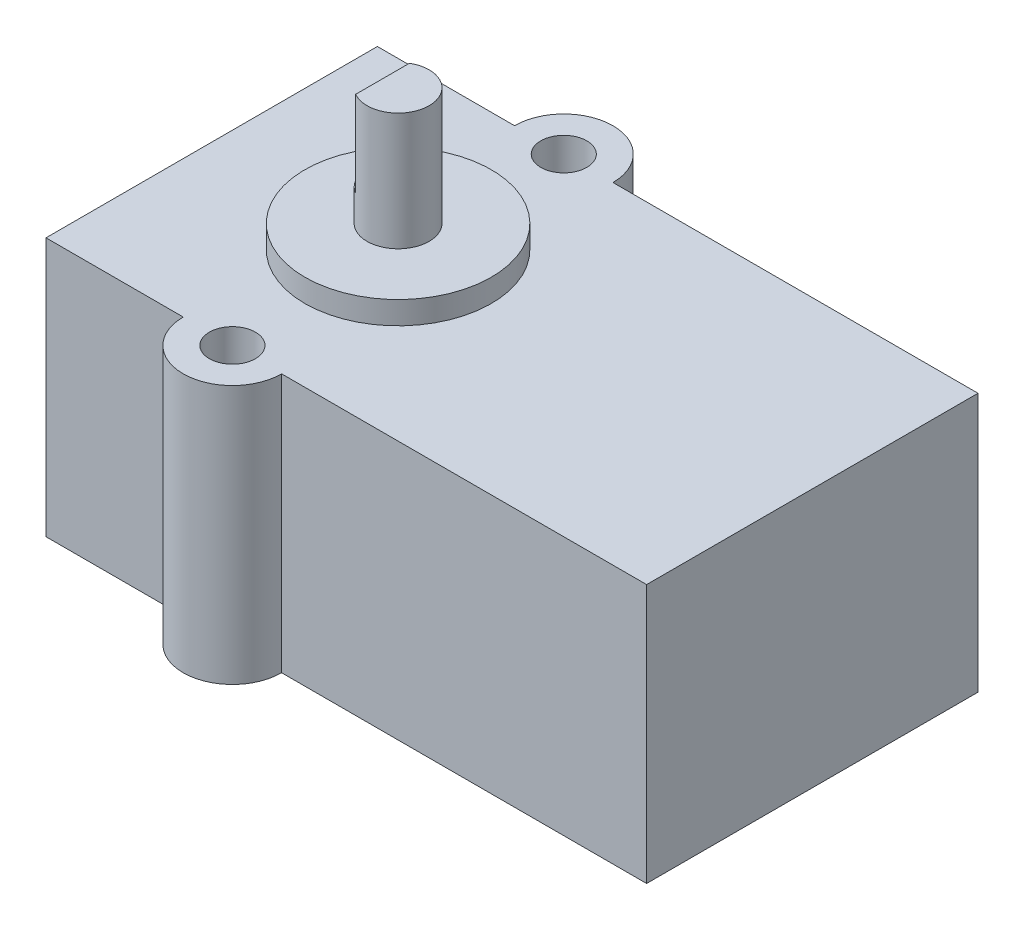
ISO-10303-21;
HEADER;
FILE_DESCRIPTION(('STEP AP214'),'2;1');
FILE_NAME('part.step','',(''),(''),'','','');
FILE_SCHEMA(('AUTOMOTIVE_DESIGN { 1 0 10303 214 1 1 1 1 }'));
ENDSEC;
DATA;
#1=APPLICATION_CONTEXT('core data for automotive mechanical design processes');
#2=APPLICATION_PROTOCOL_DEFINITION('international standard','automotive_design',2000,#1);
#3=PRODUCT_CONTEXT('',#1,'mechanical');
#4=PRODUCT('Part','Part','',(#3));
#5=PRODUCT_RELATED_PRODUCT_CATEGORY('part','',(#4));
#6=PRODUCT_DEFINITION_FORMATION('','',#4);
#7=PRODUCT_DEFINITION_CONTEXT('part definition',#1,'design');
#8=PRODUCT_DEFINITION('design','',#6,#7);
#9=PRODUCT_DEFINITION_SHAPE('','',#8);
#10=(LENGTH_UNIT() NAMED_UNIT(*) SI_UNIT(.MILLI.,.METRE.));
#11=(NAMED_UNIT(*) PLANE_ANGLE_UNIT() SI_UNIT($,.RADIAN.));
#12=(NAMED_UNIT(*) SI_UNIT($,.STERADIAN.) SOLID_ANGLE_UNIT());
#13=UNCERTAINTY_MEASURE_WITH_UNIT(LENGTH_MEASURE(1.E-05),#10,'distance_accuracy_value','');
#14=(GEOMETRIC_REPRESENTATION_CONTEXT(3) GLOBAL_UNCERTAINTY_ASSIGNED_CONTEXT((#13)) GLOBAL_UNIT_ASSIGNED_CONTEXT((#10,
#11,#12)) REPRESENTATION_CONTEXT('',''));
#15=CARTESIAN_POINT('',(0.,0.,0.));
#16=DIRECTION('',(0.,0.,1.));
#17=DIRECTION('',(1.,0.,0.));
#18=AXIS2_PLACEMENT_3D('',#15,#16,#17);
#19=CARTESIAN_POINT('',(-1.00000000000002,25.,16.));
#20=DIRECTION('',(0.,1.,0.));
#21=DIRECTION('',(0.,0.,1.));
#22=AXIS2_PLACEMENT_3D('',#19,#20,#21);
#23=PLANE('',#22);
#24=CARTESIAN_POINT('',(-0.999999999999994,25.,0.));
#25=DIRECTION('',(0.,1.,0.));
#26=DIRECTION('',(0.,0.,1.));
#27=AXIS2_PLACEMENT_3D('',#24,#25,#26);
#28=CIRCLE('',#27,9.);
#29=CARTESIAN_POINT('',(-0.999999999999994,25.,9.));
#30=VERTEX_POINT('',#29);
#31=EDGE_CURVE('E223',#30,#30,#28,.T.);
#32=ORIENTED_EDGE('',*,*,#31,.F.);
#33=EDGE_LOOP('',(#32));
#34=FACE_BOUND('',#33,.T.);
#35=CARTESIAN_POINT('',(-1.00000000000002,25.,16.));
#36=DIRECTION('',(0.,1.,0.));
#37=DIRECTION('',(0.,0.,1.));
#38=AXIS2_PLACEMENT_3D('',#35,#36,#37);
#39=CIRCLE('',#38,2.225);
#40=CARTESIAN_POINT('',(-1.00000000000002,25.,18.225));
#41=VERTEX_POINT('',#40);
#42=EDGE_CURVE('E164',#41,#41,#39,.T.);
#43=ORIENTED_EDGE('',*,*,#42,.F.);
#44=EDGE_LOOP('',(#43));
#45=FACE_BOUND('',#44,.T.);
#46=DIRECTION('',(-1.,0.,0.));
#47=VECTOR('',#46,1.);
#48=CARTESIAN_POINT('',(-5.74999999999999,25.,-16.));
#49=LINE('',#48,#47);
#50=CARTESIAN_POINT('',(-5.74999999999999,25.,-16.));
#51=VERTEX_POINT('',#50);
#52=CARTESIAN_POINT('',(-19.,25.,-16.));
#53=VERTEX_POINT('',#52);
#54=EDGE_CURVE('E183',#51,#53,#49,.T.);
#55=ORIENTED_EDGE('',*,*,#54,.T.);
#56=DIRECTION('',(0.,0.,1.));
#57=VECTOR('',#56,1.);
#58=CARTESIAN_POINT('',(-19.,25.,16.));
#59=LINE('',#58,#57);
#60=CARTESIAN_POINT('',(-19.,25.,16.));
#61=VERTEX_POINT('',#60);
#62=EDGE_CURVE('E112',#53,#61,#59,.T.);
#63=ORIENTED_EDGE('',*,*,#62,.T.);
#64=DIRECTION('',(1.,0.,0.));
#65=VECTOR('',#64,1.);
#66=CARTESIAN_POINT('',(-5.75000000000002,25.,16.));
#67=LINE('',#66,#65);
#68=CARTESIAN_POINT('',(-5.75000000000002,25.,16.));
#69=VERTEX_POINT('',#68);
#70=EDGE_CURVE('E245',#61,#69,#67,.T.);
#71=ORIENTED_EDGE('',*,*,#70,.T.);
#72=CARTESIAN_POINT('',(-1.00000000000002,25.,16.));
#73=DIRECTION('',(0.,1.,0.));
#74=DIRECTION('',(0.,0.,1.));
#75=AXIS2_PLACEMENT_3D('',#72,#73,#74);
#76=CIRCLE('',#75,4.75);
#77=CARTESIAN_POINT('',(3.74999999999998,25.,16.));
#78=VERTEX_POINT('',#77);
#79=EDGE_CURVE('E248',#69,#78,#76,.T.);
#80=ORIENTED_EDGE('',*,*,#79,.T.);
#81=DIRECTION('',(1.,0.,0.));
#82=VECTOR('',#81,1.);
#83=CARTESIAN_POINT('',(39.,25.,16.));
#84=LINE('',#83,#82);
#85=CARTESIAN_POINT('',(39.,25.,16.));
#86=VERTEX_POINT('',#85);
#87=EDGE_CURVE('E134',#78,#86,#84,.T.);
#88=ORIENTED_EDGE('',*,*,#87,.T.);
#89=DIRECTION('',(0.,0.,-1.));
#90=VECTOR('',#89,1.);
#91=CARTESIAN_POINT('',(39.,25.,16.));
#92=LINE('',#91,#90);
#93=CARTESIAN_POINT('',(39.,25.,-16.));
#94=VERTEX_POINT('',#93);
#95=EDGE_CURVE('E127',#86,#94,#92,.T.);
#96=ORIENTED_EDGE('',*,*,#95,.T.);
#97=DIRECTION('',(-1.,0.,0.));
#98=VECTOR('',#97,1.);
#99=CARTESIAN_POINT('',(39.,25.,-16.));
#100=LINE('',#99,#98);
#101=CARTESIAN_POINT('',(3.75000000000001,25.,-16.));
#102=VERTEX_POINT('',#101);
#103=EDGE_CURVE('E131',#94,#102,#100,.T.);
#104=ORIENTED_EDGE('',*,*,#103,.T.);
#105=CARTESIAN_POINT('',(-0.999999999999994,25.,-16.));
#106=DIRECTION('',(0.,1.,0.));
#107=DIRECTION('',(0.,0.,-1.));
#108=AXIS2_PLACEMENT_3D('',#105,#106,#107);
#109=CIRCLE('',#108,4.75);
#110=EDGE_CURVE('E70',#102,#51,#109,.T.);
#111=ORIENTED_EDGE('',*,*,#110,.T.);
#112=EDGE_LOOP('',(#55,#63,#71,#80,#88,#96,#104,#111));
#113=FACE_BOUND('',#112,.T.);
#114=CARTESIAN_POINT('',(-0.999999999999994,25.,-16.));
#115=DIRECTION('',(0.,1.,0.));
#116=DIRECTION('',(0.,0.,-1.));
#117=AXIS2_PLACEMENT_3D('',#114,#115,#116);
#118=CIRCLE('',#117,2.225);
#119=CARTESIAN_POINT('',(-0.999999999999994,25.,-18.225));
#120=VERTEX_POINT('',#119);
#121=EDGE_CURVE('E227',#120,#120,#118,.T.);
#122=ORIENTED_EDGE('',*,*,#121,.F.);
#123=EDGE_LOOP('',(#122));
#124=FACE_BOUND('',#123,.T.);
#125=ADVANCED_FACE('F45',(#34,#45,#113,#124),#23,.T.);
#126=CARTESIAN_POINT('',(-1.00000000000002,0.,16.));
#127=DIRECTION('',(0.,1.,0.));
#128=DIRECTION('',(0.,0.,1.));
#129=AXIS2_PLACEMENT_3D('',#126,#127,#128);
#130=PLANE('',#129);
#131=DIRECTION('',(-1.,0.,0.));
#132=VECTOR('',#131,1.);
#133=CARTESIAN_POINT('',(-5.74999999999999,0.,-16.));
#134=LINE('',#133,#132);
#135=CARTESIAN_POINT('',(-5.74999999999999,0.,-16.));
#136=VERTEX_POINT('',#135);
#137=CARTESIAN_POINT('',(-19.,0.,-16.));
#138=VERTEX_POINT('',#137);
#139=EDGE_CURVE('E159',#136,#138,#134,.T.);
#140=ORIENTED_EDGE('',*,*,#139,.F.);
#141=CARTESIAN_POINT('',(-0.999999999999994,0.,-16.));
#142=DIRECTION('',(0.,1.,0.));
#143=DIRECTION('',(0.,0.,-1.));
#144=AXIS2_PLACEMENT_3D('',#141,#142,#143);
#145=CIRCLE('',#144,4.75);
#146=CARTESIAN_POINT('',(3.75000000000001,0.,-16.));
#147=VERTEX_POINT('',#146);
#148=EDGE_CURVE('E103',#147,#136,#145,.T.);
#149=ORIENTED_EDGE('',*,*,#148,.F.);
#150=DIRECTION('',(-1.,0.,0.));
#151=VECTOR('',#150,1.);
#152=CARTESIAN_POINT('',(39.,0.,-16.));
#153=LINE('',#152,#151);
#154=CARTESIAN_POINT('',(39.,0.,-16.));
#155=VERTEX_POINT('',#154);
#156=EDGE_CURVE('E178',#155,#147,#153,.T.);
#157=ORIENTED_EDGE('',*,*,#156,.F.);
#158=DIRECTION('',(0.,0.,-1.));
#159=VECTOR('',#158,1.);
#160=CARTESIAN_POINT('',(39.,0.,16.));
#161=LINE('',#160,#159);
#162=CARTESIAN_POINT('',(39.,0.,16.));
#163=VERTEX_POINT('',#162);
#164=EDGE_CURVE('E144',#163,#155,#161,.T.);
#165=ORIENTED_EDGE('',*,*,#164,.F.);
#166=DIRECTION('',(1.,0.,0.));
#167=VECTOR('',#166,1.);
#168=CARTESIAN_POINT('',(39.,0.,16.));
#169=LINE('',#168,#167);
#170=CARTESIAN_POINT('',(3.74999999999998,0.,16.));
#171=VERTEX_POINT('',#170);
#172=EDGE_CURVE('E173',#171,#163,#169,.T.);
#173=ORIENTED_EDGE('',*,*,#172,.F.);
#174=CARTESIAN_POINT('',(-1.00000000000002,0.,16.));
#175=DIRECTION('',(0.,1.,0.));
#176=DIRECTION('',(0.,0.,1.));
#177=AXIS2_PLACEMENT_3D('',#174,#175,#176);
#178=CIRCLE('',#177,4.75);
#179=CARTESIAN_POINT('',(-5.75000000000002,0.,16.));
#180=VERTEX_POINT('',#179);
#181=EDGE_CURVE('E170',#180,#171,#178,.T.);
#182=ORIENTED_EDGE('',*,*,#181,.F.);
#183=DIRECTION('',(1.,0.,0.));
#184=VECTOR('',#183,1.);
#185=CARTESIAN_POINT('',(-5.75000000000002,0.,16.));
#186=LINE('',#185,#184);
#187=CARTESIAN_POINT('',(-19.,0.,16.));
#188=VERTEX_POINT('',#187);
#189=EDGE_CURVE('E167',#188,#180,#186,.T.);
#190=ORIENTED_EDGE('',*,*,#189,.F.);
#191=DIRECTION('',(0.,0.,1.));
#192=VECTOR('',#191,1.);
#193=CARTESIAN_POINT('',(-19.,0.,16.));
#194=LINE('',#193,#192);
#195=EDGE_CURVE('E163',#138,#188,#194,.T.);
#196=ORIENTED_EDGE('',*,*,#195,.F.);
#197=EDGE_LOOP('',(#140,#149,#157,#165,#173,#182,#190,#196));
#198=FACE_BOUND('',#197,.T.);
#199=CARTESIAN_POINT('',(-1.00000000000002,0.,16.));
#200=DIRECTION('',(0.,1.,0.));
#201=DIRECTION('',(0.,0.,1.));
#202=AXIS2_PLACEMENT_3D('',#199,#200,#201);
#203=CIRCLE('',#202,2.225);
#204=CARTESIAN_POINT('',(-1.00000000000002,0.,18.225));
#205=VERTEX_POINT('',#204);
#206=EDGE_CURVE('E231',#205,#205,#203,.T.);
#207=ORIENTED_EDGE('',*,*,#206,.T.);
#208=EDGE_LOOP('',(#207));
#209=FACE_BOUND('',#208,.T.);
#210=CARTESIAN_POINT('',(-0.999999999999994,0.,-16.));
#211=DIRECTION('',(0.,1.,0.));
#212=DIRECTION('',(0.,0.,-1.));
#213=AXIS2_PLACEMENT_3D('',#210,#211,#212);
#214=CIRCLE('',#213,2.225);
#215=CARTESIAN_POINT('',(-0.999999999999994,0.,-18.225));
#216=VERTEX_POINT('',#215);
#217=EDGE_CURVE('E222',#216,#216,#214,.T.);
#218=ORIENTED_EDGE('',*,*,#217,.T.);
#219=EDGE_LOOP('',(#218));
#220=FACE_BOUND('',#219,.T.);
#221=ADVANCED_FACE('F283',(#198,#209,#220),#130,.F.);
#222=CARTESIAN_POINT('',(-5.74999999999999,25.,-16.));
#223=DIRECTION('',(0.,0.,1.));
#224=DIRECTION('',(1.,0.,0.));
#225=AXIS2_PLACEMENT_3D('',#222,#223,#224);
#226=PLANE('',#225);
#227=ORIENTED_EDGE('',*,*,#139,.T.);
#228=DIRECTION('',(0.,-1.,0.));
#229=VECTOR('',#228,1.);
#230=CARTESIAN_POINT('',(-19.,25.,-16.));
#231=LINE('',#230,#229);
#232=EDGE_CURVE('E202',#53,#138,#231,.T.);
#233=ORIENTED_EDGE('',*,*,#232,.F.);
#234=ORIENTED_EDGE('',*,*,#54,.F.);
#235=DIRECTION('',(0.,-1.,0.));
#236=VECTOR('',#235,1.);
#237=CARTESIAN_POINT('',(-5.74999999999999,25.,-16.));
#238=LINE('',#237,#236);
#239=EDGE_CURVE('E155',#51,#136,#238,.T.);
#240=ORIENTED_EDGE('',*,*,#239,.T.);
#241=EDGE_LOOP('',(#227,#233,#234,#240));
#242=FACE_BOUND('',#241,.T.);
#243=ADVANCED_FACE('F47',(#242),#226,.F.);
#244=CARTESIAN_POINT('',(-19.,25.,16.));
#245=DIRECTION('',(1.,0.,0.));
#246=DIRECTION('',(0.,0.,-1.));
#247=AXIS2_PLACEMENT_3D('',#244,#245,#246);
#248=PLANE('',#247);
#249=ORIENTED_EDGE('',*,*,#195,.T.);
#250=DIRECTION('',(0.,-1.,0.));
#251=VECTOR('',#250,1.);
#252=CARTESIAN_POINT('',(-19.,25.,16.));
#253=LINE('',#252,#251);
#254=EDGE_CURVE('E198',#61,#188,#253,.T.);
#255=ORIENTED_EDGE('',*,*,#254,.F.);
#256=ORIENTED_EDGE('',*,*,#62,.F.);
#257=ORIENTED_EDGE('',*,*,#232,.T.);
#258=EDGE_LOOP('',(#249,#255,#256,#257));
#259=FACE_BOUND('',#258,.T.);
#260=ADVANCED_FACE('F316',(#259),#248,.F.);
#261=CARTESIAN_POINT('',(-5.75000000000002,25.,16.));
#262=DIRECTION('',(0.,0.,-1.));
#263=DIRECTION('',(-1.,0.,0.));
#264=AXIS2_PLACEMENT_3D('',#261,#262,#263);
#265=PLANE('',#264);
#266=ORIENTED_EDGE('',*,*,#189,.T.);
#267=DIRECTION('',(0.,-1.,0.));
#268=VECTOR('',#267,1.);
#269=CARTESIAN_POINT('',(-5.75000000000002,25.,16.));
#270=LINE('',#269,#268);
#271=EDGE_CURVE('E194',#69,#180,#270,.T.);
#272=ORIENTED_EDGE('',*,*,#271,.F.);
#273=ORIENTED_EDGE('',*,*,#70,.F.);
#274=ORIENTED_EDGE('',*,*,#254,.T.);
#275=EDGE_LOOP('',(#266,#272,#273,#274));
#276=FACE_BOUND('',#275,.T.);
#277=ADVANCED_FACE('F313',(#276),#265,.F.);
#278=CARTESIAN_POINT('',(-1.00000000000002,25.,16.));
#279=DIRECTION('',(0.,-1.,0.));
#280=DIRECTION('',(0.,0.,-1.));
#281=AXIS2_PLACEMENT_3D('',#278,#279,#280);
#282=CYLINDRICAL_SURFACE('',#281,4.75);
#283=ORIENTED_EDGE('',*,*,#181,.T.);
#284=DIRECTION('',(0.,-1.,0.));
#285=VECTOR('',#284,1.);
#286=CARTESIAN_POINT('',(3.74999999999998,25.,16.));
#287=LINE('',#286,#285);
#288=EDGE_CURVE('E190',#78,#171,#287,.T.);
#289=ORIENTED_EDGE('',*,*,#288,.F.);
#290=ORIENTED_EDGE('',*,*,#79,.F.);
#291=ORIENTED_EDGE('',*,*,#271,.T.);
#292=EDGE_LOOP('',(#283,#289,#290,#291));
#293=FACE_BOUND('',#292,.T.);
#294=ADVANCED_FACE('F309',(#293),#282,.T.);
#295=CARTESIAN_POINT('',(39.,25.,16.));
#296=DIRECTION('',(0.,0.,-1.));
#297=DIRECTION('',(-1.,0.,0.));
#298=AXIS2_PLACEMENT_3D('',#295,#296,#297);
#299=PLANE('',#298);
#300=ORIENTED_EDGE('',*,*,#172,.T.);
#301=DIRECTION('',(0.,-1.,0.));
#302=VECTOR('',#301,1.);
#303=CARTESIAN_POINT('',(39.,25.,16.));
#304=LINE('',#303,#302);
#305=EDGE_CURVE('E148',#86,#163,#304,.T.);
#306=ORIENTED_EDGE('',*,*,#305,.F.);
#307=ORIENTED_EDGE('',*,*,#87,.F.);
#308=ORIENTED_EDGE('',*,*,#288,.T.);
#309=EDGE_LOOP('',(#300,#306,#307,#308));
#310=FACE_BOUND('',#309,.T.);
#311=ADVANCED_FACE('F306',(#310),#299,.F.);
#312=CARTESIAN_POINT('',(39.,25.,16.));
#313=DIRECTION('',(-1.,0.,0.));
#314=DIRECTION('',(0.,0.,1.));
#315=AXIS2_PLACEMENT_3D('',#312,#313,#314);
#316=PLANE('',#315);
#317=ORIENTED_EDGE('',*,*,#164,.T.);
#318=DIRECTION('',(0.,-1.,0.));
#319=VECTOR('',#318,1.);
#320=CARTESIAN_POINT('',(39.,25.,-16.));
#321=LINE('',#320,#319);
#322=EDGE_CURVE('E141',#94,#155,#321,.T.);
#323=ORIENTED_EDGE('',*,*,#322,.F.);
#324=ORIENTED_EDGE('',*,*,#95,.F.);
#325=ORIENTED_EDGE('',*,*,#305,.T.);
#326=EDGE_LOOP('',(#317,#323,#324,#325));
#327=FACE_BOUND('',#326,.T.);
#328=ADVANCED_FACE('F142',(#327),#316,.F.);
#329=CARTESIAN_POINT('',(39.,25.,-16.));
#330=DIRECTION('',(0.,0.,1.));
#331=DIRECTION('',(1.,0.,0.));
#332=AXIS2_PLACEMENT_3D('',#329,#330,#331);
#333=PLANE('',#332);
#334=ORIENTED_EDGE('',*,*,#156,.T.);
#335=DIRECTION('',(0.,-1.,0.));
#336=VECTOR('',#335,1.);
#337=CARTESIAN_POINT('',(3.75000000000001,25.,-16.));
#338=LINE('',#337,#336);
#339=EDGE_CURVE('E149',#102,#147,#338,.T.);
#340=ORIENTED_EDGE('',*,*,#339,.F.);
#341=ORIENTED_EDGE('',*,*,#103,.F.);
#342=ORIENTED_EDGE('',*,*,#322,.T.);
#343=EDGE_LOOP('',(#334,#340,#341,#342));
#344=FACE_BOUND('',#343,.T.);
#345=ADVANCED_FACE('F151',(#344),#333,.F.);
#346=CARTESIAN_POINT('',(-0.999999999999994,25.,-16.));
#347=DIRECTION('',(0.,-1.,0.));
#348=DIRECTION('',(0.,0.,-1.));
#349=AXIS2_PLACEMENT_3D('',#346,#347,#348);
#350=CYLINDRICAL_SURFACE('',#349,4.75);
#351=ORIENTED_EDGE('',*,*,#148,.T.);
#352=ORIENTED_EDGE('',*,*,#239,.F.);
#353=ORIENTED_EDGE('',*,*,#110,.F.);
#354=ORIENTED_EDGE('',*,*,#339,.T.);
#355=EDGE_LOOP('',(#351,#352,#353,#354));
#356=FACE_BOUND('',#355,.T.);
#357=ADVANCED_FACE('F299',(#356),#350,.T.);
#358=CARTESIAN_POINT('',(-1.00000000000002,25.,16.));
#359=DIRECTION('',(0.,-1.,0.));
#360=DIRECTION('',(0.,0.,-1.));
#361=AXIS2_PLACEMENT_3D('',#358,#359,#360);
#362=CYLINDRICAL_SURFACE('',#361,2.225);
#363=ORIENTED_EDGE('',*,*,#42,.T.);
#364=EDGE_LOOP('',(#363));
#365=FACE_BOUND('',#364,.T.);
#366=ORIENTED_EDGE('',*,*,#206,.F.);
#367=EDGE_LOOP('',(#366));
#368=FACE_BOUND('',#367,.T.);
#369=ADVANCED_FACE('F296',(#365,#368),#362,.F.);
#370=CARTESIAN_POINT('',(-0.999999999999994,25.,-16.));
#371=DIRECTION('',(0.,-1.,0.));
#372=DIRECTION('',(0.,0.,-1.));
#373=AXIS2_PLACEMENT_3D('',#370,#371,#372);
#374=CYLINDRICAL_SURFACE('',#373,2.225);
#375=ORIENTED_EDGE('',*,*,#121,.T.);
#376=EDGE_LOOP('',(#375));
#377=FACE_BOUND('',#376,.T.);
#378=ORIENTED_EDGE('',*,*,#217,.F.);
#379=EDGE_LOOP('',(#378));
#380=FACE_BOUND('',#379,.T.);
#381=ADVANCED_FACE('F338',(#377,#380),#374,.F.);
#382=CARTESIAN_POINT('',(-0.999999999999994,27.2,0.));
#383=DIRECTION('',(0.,-1.,0.));
#384=DIRECTION('',(0.,0.,-1.));
#385=AXIS2_PLACEMENT_3D('',#382,#383,#384);
#386=CYLINDRICAL_SURFACE('',#385,9.);
#387=CARTESIAN_POINT('',(-0.999999999999994,27.2,0.));
#388=DIRECTION('',(0.,1.,0.));
#389=DIRECTION('',(0.,0.,1.));
#390=AXIS2_PLACEMENT_3D('',#387,#388,#389);
#391=CIRCLE('',#390,9.);
#392=CARTESIAN_POINT('',(-0.999999999999994,27.2,9.));
#393=VERTEX_POINT('',#392);
#394=EDGE_CURVE('E218',#393,#393,#391,.T.);
#395=ORIENTED_EDGE('',*,*,#394,.F.);
#396=EDGE_LOOP('',(#395));
#397=FACE_BOUND('',#396,.T.);
#398=ORIENTED_EDGE('',*,*,#31,.T.);
#399=EDGE_LOOP('',(#398));
#400=FACE_BOUND('',#399,.T.);
#401=ADVANCED_FACE('F339',(#397,#400),#386,.T.);
#402=CARTESIAN_POINT('',(-0.999999999999994,27.2,0.));
#403=DIRECTION('',(0.,1.,0.));
#404=DIRECTION('',(0.,0.,1.));
#405=AXIS2_PLACEMENT_3D('',#402,#403,#404);
#406=PLANE('',#405);
#407=CARTESIAN_POINT('',(-0.999999999999994,27.2,0.));
#408=DIRECTION('',(0.,1.,0.));
#409=DIRECTION('',(0.,0.,1.));
#410=AXIS2_PLACEMENT_3D('',#407,#408,#409);
#411=CIRCLE('',#410,3.);
#412=CARTESIAN_POINT('',(-0.999999999999994,27.2,3.));
#413=VERTEX_POINT('',#412);
#414=EDGE_CURVE('E204',#413,#413,#411,.T.);
#415=ORIENTED_EDGE('',*,*,#414,.F.);
#416=EDGE_LOOP('',(#415));
#417=FACE_BOUND('',#416,.T.);
#418=ORIENTED_EDGE('',*,*,#394,.T.);
#419=EDGE_LOOP('',(#418));
#420=FACE_BOUND('',#419,.T.);
#421=ADVANCED_FACE('F279',(#417,#420),#406,.T.);
#422=CARTESIAN_POINT('',(-0.999999999999994,38.55,0.));
#423=DIRECTION('',(0.,-1.,0.));
#424=DIRECTION('',(0.,0.,-1.));
#425=AXIS2_PLACEMENT_3D('',#422,#423,#424);
#426=CYLINDRICAL_SURFACE('',#425,3.);
#427=CARTESIAN_POINT('',(-0.999999999999994,38.55,0.));
#428=DIRECTION('',(0.,1.,0.));
#429=DIRECTION('',(0.,0.,1.));
#430=AXIS2_PLACEMENT_3D('',#427,#428,#429);
#431=CIRCLE('',#430,3.);
#432=CARTESIAN_POINT('',(-2.49999999999999,38.55,2.59807621135332));
#433=VERTEX_POINT('',#432);
#434=CARTESIAN_POINT('',(-2.5,38.55,-2.59807621135332));
#435=VERTEX_POINT('',#434);
#436=EDGE_CURVE('E216',#433,#435,#431,.T.);
#437=ORIENTED_EDGE('',*,*,#436,.F.);
#438=DIRECTION('',(0.,-1.,0.));
#439=VECTOR('',#438,1.);
#440=CARTESIAN_POINT('',(-2.49999999999999,38.55,2.59807621135332));
#441=LINE('',#440,#439);
#442=CARTESIAN_POINT('',(-2.49999999999999,30.25,2.59807621135332));
#443=VERTEX_POINT('',#442);
#444=EDGE_CURVE('E61',#433,#443,#441,.T.);
#445=ORIENTED_EDGE('',*,*,#444,.T.);
#446=CARTESIAN_POINT('',(-0.999999999999994,30.25,0.));
#447=DIRECTION('',(0.,1.,0.));
#448=DIRECTION('',(0.,0.,1.));
#449=AXIS2_PLACEMENT_3D('',#446,#447,#448);
#450=CIRCLE('',#449,3.);
#451=CARTESIAN_POINT('',(-2.5,30.25,-2.59807621135332));
#452=VERTEX_POINT('',#451);
#453=EDGE_CURVE('E11',#452,#443,#450,.T.);
#454=ORIENTED_EDGE('',*,*,#453,.F.);
#455=DIRECTION('',(0.,-1.,0.));
#456=VECTOR('',#455,1.);
#457=CARTESIAN_POINT('',(-2.5,38.55,-2.59807621135332));
#458=LINE('',#457,#456);
#459=EDGE_CURVE('E255',#452,#435,#458,.F.);
#460=ORIENTED_EDGE('',*,*,#459,.T.);
#461=EDGE_LOOP('',(#437,#445,#454,#460));
#462=FACE_BOUND('',#461,.T.);
#463=ORIENTED_EDGE('',*,*,#414,.T.);
#464=EDGE_LOOP('',(#463));
#465=FACE_BOUND('',#464,.T.);
#466=ADVANCED_FACE('F268',(#462,#465),#426,.T.);
#467=CARTESIAN_POINT('',(-0.999999999999994,38.55,0.));
#468=DIRECTION('',(0.,1.,0.));
#469=DIRECTION('',(0.,0.,1.));
#470=AXIS2_PLACEMENT_3D('',#467,#468,#469);
#471=PLANE('',#470);
#472=DIRECTION('',(0.,0.,-1.));
#473=VECTOR('',#472,1.);
#474=CARTESIAN_POINT('',(-2.5,38.55,0.));
#475=LINE('',#474,#473);
#476=EDGE_CURVE('E54',#433,#435,#475,.T.);
#477=ORIENTED_EDGE('',*,*,#476,.F.);
#478=ORIENTED_EDGE('',*,*,#436,.T.);
#479=EDGE_LOOP('',(#477,#478));
#480=FACE_BOUND('',#479,.T.);
#481=ADVANCED_FACE('F270',(#480),#471,.T.);
#482=CARTESIAN_POINT('',(0.,30.25,0.));
#483=DIRECTION('',(0.,1.,0.));
#484=DIRECTION('',(0.,0.,1.));
#485=AXIS2_PLACEMENT_3D('',#482,#483,#484);
#486=PLANE('',#485);
#487=DIRECTION('',(0.,0.,-1.));
#488=VECTOR('',#487,1.);
#489=CARTESIAN_POINT('',(-2.5,30.25,-3.));
#490=LINE('',#489,#488);
#491=EDGE_CURVE('E257',#443,#452,#490,.T.);
#492=ORIENTED_EDGE('',*,*,#491,.T.);
#493=ORIENTED_EDGE('',*,*,#453,.T.);
#494=EDGE_LOOP('',(#492,#493));
#495=FACE_BOUND('',#494,.T.);
#496=ADVANCED_FACE('F262',(#495),#486,.T.);
#497=CARTESIAN_POINT('',(-2.5,30.25,-3.));
#498=DIRECTION('',(1.,0.,0.));
#499=DIRECTION('',(0.,0.,-1.));
#500=AXIS2_PLACEMENT_3D('',#497,#498,#499);
#501=PLANE('',#500);
#502=ORIENTED_EDGE('',*,*,#476,.T.);
#503=ORIENTED_EDGE('',*,*,#459,.F.);
#504=ORIENTED_EDGE('',*,*,#491,.F.);
#505=ORIENTED_EDGE('',*,*,#444,.F.);
#506=EDGE_LOOP('',(#502,#503,#504,#505));
#507=FACE_BOUND('',#506,.T.);
#508=ADVANCED_FACE('F265',(#507),#501,.F.);
#509=CLOSED_SHELL('',(#125,#221,#243,#260,#277,#294,#311,#328,#345,#357,#369,#381,#401,#421,
#466,#481,#496,#508));
#510=MANIFOLD_SOLID_BREP('B2',#509);
#511=ADVANCED_BREP_SHAPE_REPRESENTATION('',(#18,#510),#14);
#512=SHAPE_DEFINITION_REPRESENTATION(#9,#511);
ENDSEC;
END-ISO-10303-21;
